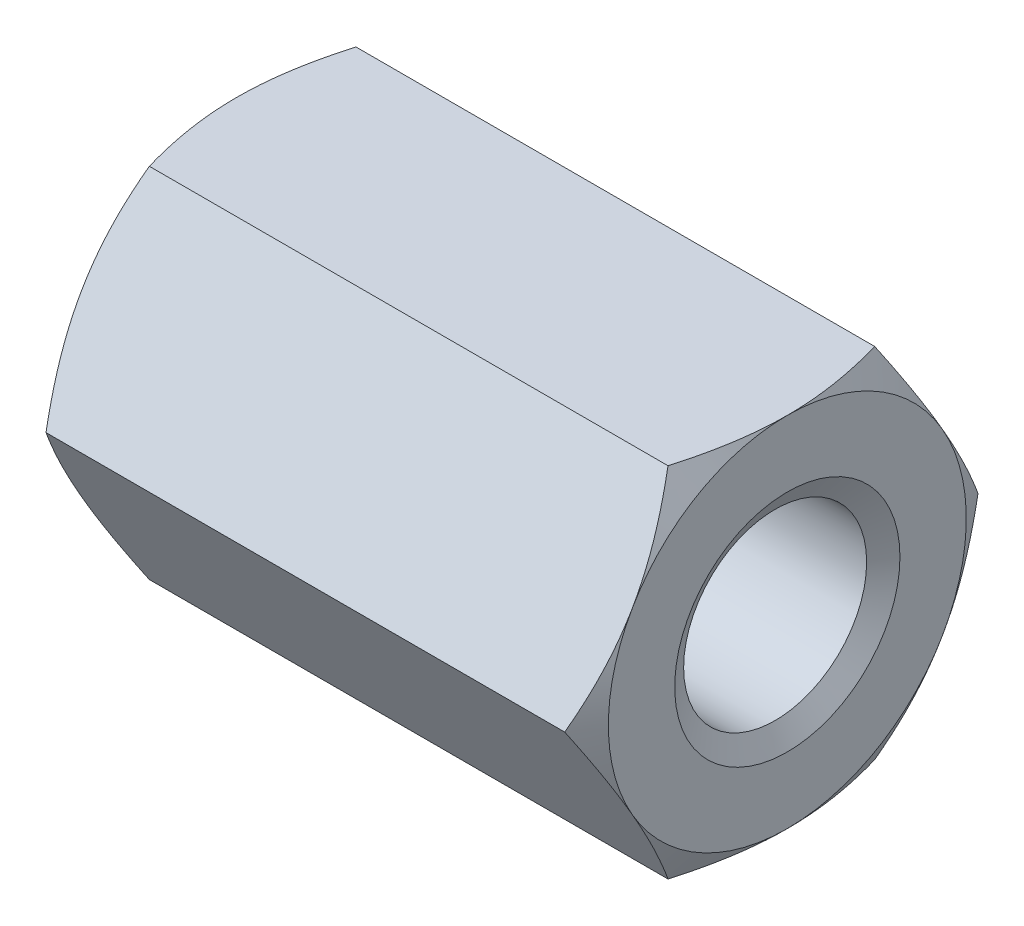
ISO-10303-21;
HEADER;
FILE_DESCRIPTION(('STEP AP214'),'2;1');
FILE_NAME('part.step','',(''),(''),'','','');
FILE_SCHEMA(('AUTOMOTIVE_DESIGN { 1 0 10303 214 1 1 1 1 }'));
ENDSEC;
DATA;
#1=APPLICATION_CONTEXT('core data for automotive mechanical design processes');
#2=APPLICATION_PROTOCOL_DEFINITION('international standard','automotive_design',2000,#1);
#3=PRODUCT_CONTEXT('',#1,'mechanical');
#4=PRODUCT('Part','Part','',(#3));
#5=PRODUCT_RELATED_PRODUCT_CATEGORY('part','',(#4));
#6=PRODUCT_DEFINITION_FORMATION('','',#4);
#7=PRODUCT_DEFINITION_CONTEXT('part definition',#1,'design');
#8=PRODUCT_DEFINITION('design','',#6,#7);
#9=PRODUCT_DEFINITION_SHAPE('','',#8);
#10=(LENGTH_UNIT() NAMED_UNIT(*) SI_UNIT(.MILLI.,.METRE.));
#11=(NAMED_UNIT(*) PLANE_ANGLE_UNIT() SI_UNIT($,.RADIAN.));
#12=(NAMED_UNIT(*) SI_UNIT($,.STERADIAN.) SOLID_ANGLE_UNIT());
#13=UNCERTAINTY_MEASURE_WITH_UNIT(LENGTH_MEASURE(1.E-05),#10,'distance_accuracy_value','');
#14=(GEOMETRIC_REPRESENTATION_CONTEXT(3) GLOBAL_UNCERTAINTY_ASSIGNED_CONTEXT((#13)) GLOBAL_UNIT_ASSIGNED_CONTEXT((#10,
#11,#12)) REPRESENTATION_CONTEXT('',''));
#15=CARTESIAN_POINT('',(0.,0.,0.));
#16=DIRECTION('',(0.,0.,1.));
#17=DIRECTION('',(1.,0.,0.));
#18=AXIS2_PLACEMENT_3D('',#15,#16,#17);
#19=CARTESIAN_POINT('',(0.,-6.5,3.75277674973257));
#20=DIRECTION('',(0.,-0.5,0.866025403784439));
#21=DIRECTION('',(-1.,0.,0.));
#22=AXIS2_PLACEMENT_3D('',#19,#20,#21);
#23=PLANE('',#22);
#24=CARTESIAN_POINT('',(0.,-3.25,5.62916512459885));
#25=CARTESIAN_POINT('',(0.,-4.75833024919772,4.75833024919771));
#26=CARTESIAN_POINT('',(0.580556583600765,-6.5,3.75277674973257));
#27=(BOUNDED_CURVE() B_SPLINE_CURVE(2,(#24,#25,#26),.UNSPECIFIED.,.F.,
.F.) B_SPLINE_CURVE_WITH_KNOTS((3,3),(0.380711317203908,0.761422634407816),
.UNSPECIFIED.) CURVE() GEOMETRIC_REPRESENTATION_ITEM() RATIONAL_B_SPLINE_CURVE((1.,
1.03795484930205,1.)) REPRESENTATION_ITEM(''));
#28=CARTESIAN_POINT('',(0.,-3.25,5.62916512459885));
#29=VERTEX_POINT('',#28);
#30=CARTESIAN_POINT('',(0.580556583600765,-6.5,3.75277674973257));
#31=VERTEX_POINT('',#30);
#32=EDGE_CURVE('E157',#29,#31,#27,.T.);
#33=ORIENTED_EDGE('',*,*,#32,.T.);
#34=DIRECTION('',(1.,0.,0.));
#35=VECTOR('',#34,1.);
#36=CARTESIAN_POINT('',(0.,-6.5,3.75277674973257));
#37=LINE('',#36,#35);
#38=CARTESIAN_POINT('',(19.4194434163992,-6.5,3.75277674973257));
#39=VERTEX_POINT('',#38);
#40=EDGE_CURVE('E11',#31,#39,#37,.T.);
#41=ORIENTED_EDGE('',*,*,#40,.T.);
#42=CARTESIAN_POINT('',(19.4194434163992,-6.5,3.75277674973256));
#43=CARTESIAN_POINT('',(20.,-4.75833024919772,4.75833024919769));
#44=CARTESIAN_POINT('',(20.,-3.25,5.62916512459885));
#45=(BOUNDED_CURVE() B_SPLINE_CURVE(2,(#42,#43,#44),.UNSPECIFIED.,.F.,
.F.) B_SPLINE_CURVE_WITH_KNOTS((3,3),(0.,0.380711317203909),
.UNSPECIFIED.) CURVE() GEOMETRIC_REPRESENTATION_ITEM() RATIONAL_B_SPLINE_CURVE((1.,
1.03795484930203,1.)) REPRESENTATION_ITEM(''));
#46=CARTESIAN_POINT('',(20.,-3.25,5.62916512459885));
#47=VERTEX_POINT('',#46);
#48=EDGE_CURVE('E154',#39,#47,#45,.T.);
#49=ORIENTED_EDGE('',*,*,#48,.T.);
#50=CARTESIAN_POINT('',(20.,-3.25,5.62916512459885));
#51=CARTESIAN_POINT('',(20.,-1.74166975080229,6.5));
#52=CARTESIAN_POINT('',(19.4194434163992,0.,7.50555349946514));
#53=(BOUNDED_CURVE() B_SPLINE_CURVE(2,(#50,#51,#52),.UNSPECIFIED.,.F.,
.F.) B_SPLINE_CURVE_WITH_KNOTS((3,3),(0.380711317203909,0.761422634407818),
.UNSPECIFIED.) CURVE() GEOMETRIC_REPRESENTATION_ITEM() RATIONAL_B_SPLINE_CURVE((1.,
1.03795484930204,1.)) REPRESENTATION_ITEM(''));
#54=CARTESIAN_POINT('',(19.4194434163992,0.,7.50555349946513));
#55=VERTEX_POINT('',#54);
#56=EDGE_CURVE('E179',#47,#55,#53,.T.);
#57=ORIENTED_EDGE('',*,*,#56,.T.);
#58=DIRECTION('',(1.,0.,0.));
#59=VECTOR('',#58,1.);
#60=CARTESIAN_POINT('',(0.,0.,7.50555349946513));
#61=LINE('',#60,#59);
#62=CARTESIAN_POINT('',(0.580556583600765,0.,7.50555349946513));
#63=VERTEX_POINT('',#62);
#64=EDGE_CURVE('E327',#63,#55,#61,.T.);
#65=ORIENTED_EDGE('',*,*,#64,.F.);
#66=CARTESIAN_POINT('',(0.580556583600765,0.,7.50555349946513));
#67=CARTESIAN_POINT('',(0.,-1.74166975080229,6.50000000000001));
#68=CARTESIAN_POINT('',(0.,-3.25,5.62916512459885));
#69=(BOUNDED_CURVE() B_SPLINE_CURVE(2,(#66,#67,#68),.UNSPECIFIED.,.F.,
.F.) B_SPLINE_CURVE_WITH_KNOTS((3,3),(0.,0.380711317203908),
.UNSPECIFIED.) CURVE() GEOMETRIC_REPRESENTATION_ITEM() RATIONAL_B_SPLINE_CURVE((1.,
1.03795484930205,1.)) REPRESENTATION_ITEM(''));
#70=EDGE_CURVE('E208',#63,#29,#69,.T.);
#71=ORIENTED_EDGE('',*,*,#70,.T.);
#72=EDGE_LOOP('',(#33,#41,#49,#57,#65,#71));
#73=FACE_BOUND('',#72,.T.);
#74=ADVANCED_FACE('F16',(#73),#23,.T.);
#75=CARTESIAN_POINT('',(0.,-6.5,-3.75277674973257));
#76=DIRECTION('',(0.,-1.,0.));
#77=DIRECTION('',(0.,0.,-1.));
#78=AXIS2_PLACEMENT_3D('',#75,#76,#77);
#79=PLANE('',#78);
#80=CARTESIAN_POINT('',(0.,-6.5,0.));
#81=CARTESIAN_POINT('',(0.,-6.5,-1.7416697508023));
#82=CARTESIAN_POINT('',(0.580556583600766,-6.5,-3.75277674973257));
#83=(BOUNDED_CURVE() B_SPLINE_CURVE(2,(#80,#81,#82),.UNSPECIFIED.,.F.,
.F.) B_SPLINE_CURVE_WITH_KNOTS((3,3),(0.380711317203908,0.761422634407816),
.UNSPECIFIED.) CURVE() GEOMETRIC_REPRESENTATION_ITEM() RATIONAL_B_SPLINE_CURVE((1.,
1.03795484930204,1.)) REPRESENTATION_ITEM(''));
#84=CARTESIAN_POINT('',(0.,-6.5,0.));
#85=VERTEX_POINT('',#84);
#86=CARTESIAN_POINT('',(0.580556583600765,-6.5,-3.75277674973257));
#87=VERTEX_POINT('',#86);
#88=EDGE_CURVE('E357',#85,#87,#83,.T.);
#89=ORIENTED_EDGE('',*,*,#88,.T.);
#90=DIRECTION('',(1.,0.,0.));
#91=VECTOR('',#90,1.);
#92=CARTESIAN_POINT('',(0.,-6.5,-3.75277674973257));
#93=LINE('',#92,#91);
#94=CARTESIAN_POINT('',(19.4194434163992,-6.5,-3.75277674973257));
#95=VERTEX_POINT('',#94);
#96=EDGE_CURVE('E27',#87,#95,#93,.T.);
#97=ORIENTED_EDGE('',*,*,#96,.T.);
#98=CARTESIAN_POINT('',(19.4194434163992,-6.5,-3.75277674973256));
#99=CARTESIAN_POINT('',(20.,-6.5,-1.74166975080229));
#100=CARTESIAN_POINT('',(20.,-6.5,0.));
#101=(BOUNDED_CURVE() B_SPLINE_CURVE(2,(#98,#99,#100),.UNSPECIFIED.,.F.,
.F.) B_SPLINE_CURVE_WITH_KNOTS((3,3),(0.,0.380711317203908),
.UNSPECIFIED.) CURVE() GEOMETRIC_REPRESENTATION_ITEM() RATIONAL_B_SPLINE_CURVE((1.,
1.03795484930204,1.)) REPRESENTATION_ITEM(''));
#102=CARTESIAN_POINT('',(20.,-6.5,0.));
#103=VERTEX_POINT('',#102);
#104=EDGE_CURVE('E177',#95,#103,#101,.T.);
#105=ORIENTED_EDGE('',*,*,#104,.T.);
#106=CARTESIAN_POINT('',(20.,-6.5,0.));
#107=CARTESIAN_POINT('',(20.,-6.5,1.74166975080229));
#108=CARTESIAN_POINT('',(19.4194434163992,-6.5,3.75277674973256));
#109=(BOUNDED_CURVE() B_SPLINE_CURVE(2,(#106,#107,#108),.UNSPECIFIED.,.F.,
.F.) B_SPLINE_CURVE_WITH_KNOTS((3,3),(0.380711317203908,0.761422634407815),
.UNSPECIFIED.) CURVE() GEOMETRIC_REPRESENTATION_ITEM() RATIONAL_B_SPLINE_CURVE((1.,
1.03795484930204,1.)) REPRESENTATION_ITEM(''));
#110=EDGE_CURVE('E166',#103,#39,#109,.T.);
#111=ORIENTED_EDGE('',*,*,#110,.T.);
#112=ORIENTED_EDGE('',*,*,#40,.F.);
#113=CARTESIAN_POINT('',(0.580556583600766,-6.5,3.75277674973257));
#114=CARTESIAN_POINT('',(0.,-6.5,1.7416697508023));
#115=CARTESIAN_POINT('',(0.,-6.5,0.));
#116=(BOUNDED_CURVE() B_SPLINE_CURVE(2,(#113,#114,#115),.UNSPECIFIED.,.F.,
.F.) B_SPLINE_CURVE_WITH_KNOTS((3,3),(0.,0.380711317203908),
.UNSPECIFIED.) CURVE() GEOMETRIC_REPRESENTATION_ITEM() RATIONAL_B_SPLINE_CURVE((1.,
1.03795484930204,1.)) REPRESENTATION_ITEM(''));
#117=EDGE_CURVE('E199',#31,#85,#116,.T.);
#118=ORIENTED_EDGE('',*,*,#117,.T.);
#119=EDGE_LOOP('',(#89,#97,#105,#111,#112,#118));
#120=FACE_BOUND('',#119,.T.);
#121=ADVANCED_FACE('F175',(#120),#79,.T.);
#122=CARTESIAN_POINT('',(0.,0.,-7.50555349946513));
#123=DIRECTION('',(0.,-0.5,-0.866025403784439));
#124=DIRECTION('',(0.,-0.866025403784439,0.5));
#125=AXIS2_PLACEMENT_3D('',#122,#123,#124);
#126=PLANE('',#125);
#127=CARTESIAN_POINT('',(0.,-3.25,-5.62916512459885));
#128=CARTESIAN_POINT('',(0.,-1.74166975080229,-6.50000000000001));
#129=CARTESIAN_POINT('',(0.580556583600766,0.,-7.50555349946514));
#130=(BOUNDED_CURVE() B_SPLINE_CURVE(2,(#127,#128,#129),.UNSPECIFIED.,.F.,
.F.) B_SPLINE_CURVE_WITH_KNOTS((3,3),(0.380711317203908,0.761422634407816),
.UNSPECIFIED.) CURVE() GEOMETRIC_REPRESENTATION_ITEM() RATIONAL_B_SPLINE_CURVE((1.,
1.03795484930205,1.)) REPRESENTATION_ITEM(''));
#131=CARTESIAN_POINT('',(0.,-3.25,-5.62916512459885));
#132=VERTEX_POINT('',#131);
#133=CARTESIAN_POINT('',(0.580556583600765,0.,-7.50555349946513));
#134=VERTEX_POINT('',#133);
#135=EDGE_CURVE('E263',#132,#134,#130,.T.);
#136=ORIENTED_EDGE('',*,*,#135,.T.);
#137=DIRECTION('',(1.,0.,0.));
#138=VECTOR('',#137,1.);
#139=CARTESIAN_POINT('',(0.,0.,-7.50555349946513));
#140=LINE('',#139,#138);
#141=CARTESIAN_POINT('',(19.4194434163992,0.,-7.50555349946513));
#142=VERTEX_POINT('',#141);
#143=EDGE_CURVE('E40',#134,#142,#140,.T.);
#144=ORIENTED_EDGE('',*,*,#143,.T.);
#145=CARTESIAN_POINT('',(19.4194434163992,0.,-7.50555349946513));
#146=CARTESIAN_POINT('',(20.,-1.7416697508023,-6.50000000000001));
#147=CARTESIAN_POINT('',(20.,-3.25,-5.62916512459885));
#148=(BOUNDED_CURVE() B_SPLINE_CURVE(2,(#145,#146,#147),.UNSPECIFIED.,.F.,
.F.) B_SPLINE_CURVE_WITH_KNOTS((3,3),(0.,0.380711317203907),
.UNSPECIFIED.) CURVE() GEOMETRIC_REPRESENTATION_ITEM() RATIONAL_B_SPLINE_CURVE((1.,
1.03795484930205,1.)) REPRESENTATION_ITEM(''));
#149=CARTESIAN_POINT('',(20.,-3.25,-5.62916512459885));
#150=VERTEX_POINT('',#149);
#151=EDGE_CURVE('E324',#142,#150,#148,.T.);
#152=ORIENTED_EDGE('',*,*,#151,.T.);
#153=CARTESIAN_POINT('',(20.,-3.25,-5.62916512459885));
#154=CARTESIAN_POINT('',(20.,-4.7583302491977,-4.7583302491977));
#155=CARTESIAN_POINT('',(19.4194434163992,-6.5,-3.75277674973257));
#156=(BOUNDED_CURVE() B_SPLINE_CURVE(2,(#153,#154,#155),.UNSPECIFIED.,.F.,
.F.) B_SPLINE_CURVE_WITH_KNOTS((3,3),(0.380711317203907,0.761422634407814),
.UNSPECIFIED.) CURVE() GEOMETRIC_REPRESENTATION_ITEM() RATIONAL_B_SPLINE_CURVE((1.,
1.03795484930206,1.)) REPRESENTATION_ITEM(''));
#157=EDGE_CURVE('E222',#150,#95,#156,.T.);
#158=ORIENTED_EDGE('',*,*,#157,.T.);
#159=ORIENTED_EDGE('',*,*,#96,.F.);
#160=CARTESIAN_POINT('',(0.580556583600766,-6.5,-3.75277674973257));
#161=CARTESIAN_POINT('',(0.,-4.75833024919771,-4.7583302491977));
#162=CARTESIAN_POINT('',(0.,-3.25,-5.62916512459885));
#163=(BOUNDED_CURVE() B_SPLINE_CURVE(2,(#160,#161,#162),.UNSPECIFIED.,.F.,
.F.) B_SPLINE_CURVE_WITH_KNOTS((3,3),(0.,0.380711317203908),
.UNSPECIFIED.) CURVE() GEOMETRIC_REPRESENTATION_ITEM() RATIONAL_B_SPLINE_CURVE((1.,
1.03795484930204,1.)) REPRESENTATION_ITEM(''));
#164=EDGE_CURVE('E294',#87,#132,#163,.T.);
#165=ORIENTED_EDGE('',*,*,#164,.T.);
#166=EDGE_LOOP('',(#136,#144,#152,#158,#159,#165));
#167=FACE_BOUND('',#166,.T.);
#168=ADVANCED_FACE('F363',(#167),#126,.T.);
#169=CARTESIAN_POINT('',(0.,0.,7.50555349946513));
#170=DIRECTION('',(0.,0.5,0.866025403784439));
#171=DIRECTION('',(1.,0.,0.));
#172=AXIS2_PLACEMENT_3D('',#169,#170,#171);
#173=PLANE('',#172);
#174=CARTESIAN_POINT('',(0.580556583600766,6.5,3.75277674973256));
#175=CARTESIAN_POINT('',(0.,4.75833024919772,4.75833024919771));
#176=CARTESIAN_POINT('',(0.,3.25,5.62916512459885));
#177=(BOUNDED_CURVE() B_SPLINE_CURVE(2,(#174,#175,#176),.UNSPECIFIED.,.F.,
.F.) B_SPLINE_CURVE_WITH_KNOTS((3,3),(0.,0.380711317203908),
.UNSPECIFIED.) CURVE() GEOMETRIC_REPRESENTATION_ITEM() RATIONAL_B_SPLINE_CURVE((1.,
1.03795484930205,1.)) REPRESENTATION_ITEM(''));
#178=CARTESIAN_POINT('',(0.580556583600765,6.5,3.75277674973256));
#179=VERTEX_POINT('',#178);
#180=CARTESIAN_POINT('',(0.,3.25,5.62916512459885));
#181=VERTEX_POINT('',#180);
#182=EDGE_CURVE('E206',#179,#181,#177,.T.);
#183=ORIENTED_EDGE('',*,*,#182,.T.);
#184=CARTESIAN_POINT('',(0.,3.25,5.62916512459885));
#185=CARTESIAN_POINT('',(0.,1.7416697508023,6.5));
#186=CARTESIAN_POINT('',(0.580556583600766,0.,7.50555349946514));
#187=(BOUNDED_CURVE() B_SPLINE_CURVE(2,(#184,#185,#186),.UNSPECIFIED.,.F.,
.F.) B_SPLINE_CURVE_WITH_KNOTS((3,3),(0.380711317203908,0.761422634407816),
.UNSPECIFIED.) CURVE() GEOMETRIC_REPRESENTATION_ITEM() RATIONAL_B_SPLINE_CURVE((1.,
1.03795484930204,1.)) REPRESENTATION_ITEM(''));
#188=EDGE_CURVE('E214',#181,#63,#187,.T.);
#189=ORIENTED_EDGE('',*,*,#188,.T.);
#190=ORIENTED_EDGE('',*,*,#64,.T.);
#191=CARTESIAN_POINT('',(19.4194434163992,0.,7.50555349946513));
#192=CARTESIAN_POINT('',(20.,1.7416697508023,6.50000000000001));
#193=CARTESIAN_POINT('',(20.,3.25,5.62916512459885));
#194=(BOUNDED_CURVE() B_SPLINE_CURVE(2,(#191,#192,#193),.UNSPECIFIED.,.F.,
.F.) B_SPLINE_CURVE_WITH_KNOTS((3,3),(0.,0.380711317203907),
.UNSPECIFIED.) CURVE() GEOMETRIC_REPRESENTATION_ITEM() RATIONAL_B_SPLINE_CURVE((1.,
1.03795484930205,1.)) REPRESENTATION_ITEM(''));
#195=CARTESIAN_POINT('',(20.,3.25,5.62916512459885));
#196=VERTEX_POINT('',#195);
#197=EDGE_CURVE('E185',#55,#196,#194,.T.);
#198=ORIENTED_EDGE('',*,*,#197,.T.);
#199=CARTESIAN_POINT('',(20.,3.25,5.62916512459885));
#200=CARTESIAN_POINT('',(20.,4.75833024919771,4.7583302491977));
#201=CARTESIAN_POINT('',(19.4194434163992,6.5,3.75277674973257));
#202=(BOUNDED_CURVE() B_SPLINE_CURVE(2,(#199,#200,#201),.UNSPECIFIED.,.F.,
.F.) B_SPLINE_CURVE_WITH_KNOTS((3,3),(0.380711317203907,0.761422634407815),
.UNSPECIFIED.) CURVE() GEOMETRIC_REPRESENTATION_ITEM() RATIONAL_B_SPLINE_CURVE((1.,
1.03795484930206,1.)) REPRESENTATION_ITEM(''));
#203=CARTESIAN_POINT('',(19.4194434163992,6.5,3.75277674973256));
#204=VERTEX_POINT('',#203);
#205=EDGE_CURVE('E68',#196,#204,#202,.T.);
#206=ORIENTED_EDGE('',*,*,#205,.T.);
#207=DIRECTION('',(1.,0.,0.));
#208=VECTOR('',#207,1.);
#209=CARTESIAN_POINT('',(0.,6.5,3.75277674973256));
#210=LINE('',#209,#208);
#211=EDGE_CURVE('E261',#179,#204,#210,.T.);
#212=ORIENTED_EDGE('',*,*,#211,.F.);
#213=EDGE_LOOP('',(#183,#189,#190,#198,#206,#212));
#214=FACE_BOUND('',#213,.T.);
#215=ADVANCED_FACE('F525',(#214),#173,.T.);
#216=CARTESIAN_POINT('',(0.,6.5,3.75277674973256));
#217=DIRECTION('',(0.,1.,0.));
#218=DIRECTION('',(0.,0.,-1.));
#219=AXIS2_PLACEMENT_3D('',#216,#217,#218);
#220=PLANE('',#219);
#221=CARTESIAN_POINT('',(0.580556583600766,6.5,-3.75277674973257));
#222=CARTESIAN_POINT('',(0.,6.5,-1.7416697508023));
#223=CARTESIAN_POINT('',(0.,6.5,0.));
#224=(BOUNDED_CURVE() B_SPLINE_CURVE(2,(#221,#222,#223),.UNSPECIFIED.,.F.,
.F.) B_SPLINE_CURVE_WITH_KNOTS((3,3),(0.,0.380711317203908),
.UNSPECIFIED.) CURVE() GEOMETRIC_REPRESENTATION_ITEM() RATIONAL_B_SPLINE_CURVE((1.,
1.03795484930204,1.)) REPRESENTATION_ITEM(''));
#225=CARTESIAN_POINT('',(0.580556583600765,6.5,-3.75277674973257));
#226=VERTEX_POINT('',#225);
#227=CARTESIAN_POINT('',(0.,6.5,0.));
#228=VERTEX_POINT('',#227);
#229=EDGE_CURVE('E281',#226,#228,#224,.T.);
#230=ORIENTED_EDGE('',*,*,#229,.T.);
#231=CARTESIAN_POINT('',(0.,6.5,0.));
#232=CARTESIAN_POINT('',(0.,6.5,1.7416697508023));
#233=CARTESIAN_POINT('',(0.580556583600766,6.5,3.75277674973257));
#234=(BOUNDED_CURVE() B_SPLINE_CURVE(2,(#231,#232,#233),.UNSPECIFIED.,.F.,
.F.) B_SPLINE_CURVE_WITH_KNOTS((3,3),(0.380711317203908,0.761422634407816),
.UNSPECIFIED.) CURVE() GEOMETRIC_REPRESENTATION_ITEM() RATIONAL_B_SPLINE_CURVE((1.,
1.03795484930204,1.)) REPRESENTATION_ITEM(''));
#235=EDGE_CURVE('E190',#228,#179,#234,.T.);
#236=ORIENTED_EDGE('',*,*,#235,.T.);
#237=ORIENTED_EDGE('',*,*,#211,.T.);
#238=CARTESIAN_POINT('',(19.4194434163992,6.5,3.75277674973256));
#239=CARTESIAN_POINT('',(20.,6.5,1.74166975080229));
#240=CARTESIAN_POINT('',(20.,6.5,0.));
#241=(BOUNDED_CURVE() B_SPLINE_CURVE(2,(#238,#239,#240),.UNSPECIFIED.,.F.,
.F.) B_SPLINE_CURVE_WITH_KNOTS((3,3),(0.,0.380711317203908),
.UNSPECIFIED.) CURVE() GEOMETRIC_REPRESENTATION_ITEM() RATIONAL_B_SPLINE_CURVE((1.,
1.03795484930204,1.)) REPRESENTATION_ITEM(''));
#242=CARTESIAN_POINT('',(20.,6.5,0.));
#243=VERTEX_POINT('',#242);
#244=EDGE_CURVE('E171',#204,#243,#241,.T.);
#245=ORIENTED_EDGE('',*,*,#244,.T.);
#246=CARTESIAN_POINT('',(20.,6.5,0.));
#247=CARTESIAN_POINT('',(20.,6.50000000000001,-1.7416697508023));
#248=CARTESIAN_POINT('',(19.4194434163992,6.5,-3.75277674973257));
#249=(BOUNDED_CURVE() B_SPLINE_CURVE(2,(#246,#247,#248),.UNSPECIFIED.,.F.,
.F.) B_SPLINE_CURVE_WITH_KNOTS((3,3),(0.380711317203908,0.761422634407816),
.UNSPECIFIED.) CURVE() GEOMETRIC_REPRESENTATION_ITEM() RATIONAL_B_SPLINE_CURVE((1.,
1.03795484930205,1.)) REPRESENTATION_ITEM(''));
#250=CARTESIAN_POINT('',(19.4194434163992,6.5,-3.75277674973257));
#251=VERTEX_POINT('',#250);
#252=EDGE_CURVE('E83',#243,#251,#249,.T.);
#253=ORIENTED_EDGE('',*,*,#252,.T.);
#254=DIRECTION('',(1.,0.,0.));
#255=VECTOR('',#254,1.);
#256=CARTESIAN_POINT('',(0.,6.5,-3.75277674973257));
#257=LINE('',#256,#255);
#258=EDGE_CURVE('E262',#226,#251,#257,.T.);
#259=ORIENTED_EDGE('',*,*,#258,.F.);
#260=EDGE_LOOP('',(#230,#236,#237,#245,#253,#259));
#261=FACE_BOUND('',#260,.T.);
#262=ADVANCED_FACE('F534',(#261),#220,.T.);
#263=CARTESIAN_POINT('',(0.,6.5,-3.75277674973257));
#264=DIRECTION('',(0.,0.5,-0.866025403784439));
#265=DIRECTION('',(-1.,0.,0.));
#266=AXIS2_PLACEMENT_3D('',#263,#264,#265);
#267=PLANE('',#266);
#268=CARTESIAN_POINT('',(0.580556583600766,0.,-7.50555349946513));
#269=CARTESIAN_POINT('',(0.,1.7416697508023,-6.50000000000001));
#270=CARTESIAN_POINT('',(0.,3.25,-5.62916512459885));
#271=(BOUNDED_CURVE() B_SPLINE_CURVE(2,(#268,#269,#270),.UNSPECIFIED.,.F.,
.F.) B_SPLINE_CURVE_WITH_KNOTS((3,3),(0.,0.380711317203908),
.UNSPECIFIED.) CURVE() GEOMETRIC_REPRESENTATION_ITEM() RATIONAL_B_SPLINE_CURVE((1.,
1.03795484930205,1.)) REPRESENTATION_ITEM(''));
#272=CARTESIAN_POINT('',(0.,3.25,-5.62916512459885));
#273=VERTEX_POINT('',#272);
#274=EDGE_CURVE('E267',#134,#273,#271,.T.);
#275=ORIENTED_EDGE('',*,*,#274,.T.);
#276=CARTESIAN_POINT('',(0.,3.25,-5.62916512459885));
#277=CARTESIAN_POINT('',(0.,4.75833024919771,-4.75833024919772));
#278=CARTESIAN_POINT('',(0.580556583600765,6.5,-3.75277674973257));
#279=(BOUNDED_CURVE() B_SPLINE_CURVE(2,(#276,#277,#278),.UNSPECIFIED.,.F.,
.F.) B_SPLINE_CURVE_WITH_KNOTS((3,3),(0.380711317203908,0.761422634407815),
.UNSPECIFIED.) CURVE() GEOMETRIC_REPRESENTATION_ITEM() RATIONAL_B_SPLINE_CURVE((1.,
1.03795484930205,1.)) REPRESENTATION_ITEM(''));
#280=EDGE_CURVE('E354',#273,#226,#279,.T.);
#281=ORIENTED_EDGE('',*,*,#280,.T.);
#282=ORIENTED_EDGE('',*,*,#258,.T.);
#283=CARTESIAN_POINT('',(19.4194434163992,6.5,-3.75277674973257));
#284=CARTESIAN_POINT('',(20.,4.75833024919771,-4.7583302491977));
#285=CARTESIAN_POINT('',(20.,3.25,-5.62916512459885));
#286=(BOUNDED_CURVE() B_SPLINE_CURVE(2,(#283,#284,#285),.UNSPECIFIED.,.F.,
.F.) B_SPLINE_CURVE_WITH_KNOTS((3,3),(0.,0.380711317203908),
.UNSPECIFIED.) CURVE() GEOMETRIC_REPRESENTATION_ITEM() RATIONAL_B_SPLINE_CURVE((1.,
1.03795484930201,1.)) REPRESENTATION_ITEM(''));
#287=CARTESIAN_POINT('',(20.,3.25,-5.62916512459885));
#288=VERTEX_POINT('',#287);
#289=EDGE_CURVE('E302',#251,#288,#286,.T.);
#290=ORIENTED_EDGE('',*,*,#289,.T.);
#291=CARTESIAN_POINT('',(20.,3.25,-5.62916512459885));
#292=CARTESIAN_POINT('',(20.,1.74166975080229,-6.50000000000002));
#293=CARTESIAN_POINT('',(19.4194434163992,0.,-7.50555349946513));
#294=(BOUNDED_CURVE() B_SPLINE_CURVE(2,(#291,#292,#293),.UNSPECIFIED.,.F.,
.F.) B_SPLINE_CURVE_WITH_KNOTS((3,3),(0.380711317203908,0.761422634407815),
.UNSPECIFIED.) CURVE() GEOMETRIC_REPRESENTATION_ITEM() RATIONAL_B_SPLINE_CURVE((1.,
1.03795484930201,1.)) REPRESENTATION_ITEM(''));
#295=EDGE_CURVE('E383',#288,#142,#294,.T.);
#296=ORIENTED_EDGE('',*,*,#295,.T.);
#297=ORIENTED_EDGE('',*,*,#143,.F.);
#298=EDGE_LOOP('',(#275,#281,#282,#290,#296,#297));
#299=FACE_BOUND('',#298,.T.);
#300=ADVANCED_FACE('F531',(#299),#267,.T.);
#301=CARTESIAN_POINT('',(19.7097217081996,0.,0.));
#302=DIRECTION('',(-1.,0.,0.));
#303=DIRECTION('',(0.,1.,0.));
#304=AXIS2_PLACEMENT_3D('',#301,#302,#303);
#305=CONICAL_SURFACE('',#304,7.00277674973257,1.0471975511966);
#306=ORIENTED_EDGE('',*,*,#295,.F.);
#307=CARTESIAN_POINT('',(20.,0.,0.));
#308=DIRECTION('',(1.,0.,0.));
#309=DIRECTION('',(0.,1.,0.));
#310=AXIS2_PLACEMENT_3D('',#307,#308,#309);
#311=CIRCLE('',#310,6.5);
#312=EDGE_CURVE('E416',#150,#288,#311,.T.);
#313=ORIENTED_EDGE('',*,*,#312,.F.);
#314=ORIENTED_EDGE('',*,*,#151,.F.);
#315=EDGE_LOOP('',(#306,#313,#314));
#316=FACE_BOUND('',#315,.T.);
#317=ADVANCED_FACE('F528',(#316),#305,.T.);
#318=CARTESIAN_POINT('',(19.7097217081996,0.,0.));
#319=DIRECTION('',(-1.,0.,0.));
#320=DIRECTION('',(0.,1.,0.));
#321=AXIS2_PLACEMENT_3D('',#318,#319,#320);
#322=CONICAL_SURFACE('',#321,7.00277674973257,1.0471975511966);
#323=ORIENTED_EDGE('',*,*,#157,.F.);
#324=CARTESIAN_POINT('',(20.,0.,0.));
#325=DIRECTION('',(1.,0.,0.));
#326=DIRECTION('',(0.,1.,0.));
#327=AXIS2_PLACEMENT_3D('',#324,#325,#326);
#328=CIRCLE('',#327,6.5);
#329=EDGE_CURVE('E409',#103,#150,#328,.T.);
#330=ORIENTED_EDGE('',*,*,#329,.F.);
#331=ORIENTED_EDGE('',*,*,#104,.F.);
#332=EDGE_LOOP('',(#323,#330,#331));
#333=FACE_BOUND('',#332,.T.);
#334=ADVANCED_FACE('F530',(#333),#322,.T.);
#335=CARTESIAN_POINT('',(19.7097217081996,0.,0.));
#336=DIRECTION('',(-1.,0.,0.));
#337=DIRECTION('',(0.,1.,0.));
#338=AXIS2_PLACEMENT_3D('',#335,#336,#337);
#339=CONICAL_SURFACE('',#338,7.00277674973257,1.0471975511966);
#340=ORIENTED_EDGE('',*,*,#289,.F.);
#341=ORIENTED_EDGE('',*,*,#252,.F.);
#342=CARTESIAN_POINT('',(20.,0.,0.));
#343=DIRECTION('',(1.,0.,0.));
#344=DIRECTION('',(0.,1.,0.));
#345=AXIS2_PLACEMENT_3D('',#342,#343,#344);
#346=CIRCLE('',#345,6.5);
#347=EDGE_CURVE('E457',#288,#243,#346,.T.);
#348=ORIENTED_EDGE('',*,*,#347,.F.);
#349=EDGE_LOOP('',(#340,#341,#348));
#350=FACE_BOUND('',#349,.T.);
#351=ADVANCED_FACE('F539',(#350),#339,.T.);
#352=CARTESIAN_POINT('',(19.7097217081996,0.,0.));
#353=DIRECTION('',(-1.,0.,0.));
#354=DIRECTION('',(0.,1.,0.));
#355=AXIS2_PLACEMENT_3D('',#352,#353,#354);
#356=CONICAL_SURFACE('',#355,7.00277674973257,1.0471975511966);
#357=ORIENTED_EDGE('',*,*,#244,.F.);
#358=ORIENTED_EDGE('',*,*,#205,.F.);
#359=CARTESIAN_POINT('',(20.,0.,0.));
#360=DIRECTION('',(1.,0.,0.));
#361=DIRECTION('',(0.,1.,0.));
#362=AXIS2_PLACEMENT_3D('',#359,#360,#361);
#363=CIRCLE('',#362,6.5);
#364=EDGE_CURVE('E460',#243,#196,#363,.T.);
#365=ORIENTED_EDGE('',*,*,#364,.F.);
#366=EDGE_LOOP('',(#357,#358,#365));
#367=FACE_BOUND('',#366,.T.);
#368=ADVANCED_FACE('F541',(#367),#356,.T.);
#369=CARTESIAN_POINT('',(19.7097217081996,0.,0.));
#370=DIRECTION('',(-1.,0.,0.));
#371=DIRECTION('',(0.,1.,0.));
#372=AXIS2_PLACEMENT_3D('',#369,#370,#371);
#373=CONICAL_SURFACE('',#372,7.00277674973257,1.0471975511966);
#374=ORIENTED_EDGE('',*,*,#110,.F.);
#375=CARTESIAN_POINT('',(20.,0.,0.));
#376=DIRECTION('',(1.,0.,0.));
#377=DIRECTION('',(0.,1.,0.));
#378=AXIS2_PLACEMENT_3D('',#375,#376,#377);
#379=CIRCLE('',#378,6.5);
#380=EDGE_CURVE('E169',#47,#103,#379,.T.);
#381=ORIENTED_EDGE('',*,*,#380,.F.);
#382=ORIENTED_EDGE('',*,*,#48,.F.);
#383=EDGE_LOOP('',(#374,#381,#382));
#384=FACE_BOUND('',#383,.T.);
#385=ADVANCED_FACE('F165',(#384),#373,.T.);
#386=CARTESIAN_POINT('',(19.7097217081996,0.,0.));
#387=DIRECTION('',(-1.,0.,0.));
#388=DIRECTION('',(0.,1.,0.));
#389=AXIS2_PLACEMENT_3D('',#386,#387,#388);
#390=CONICAL_SURFACE('',#389,7.00277674973257,1.0471975511966);
#391=ORIENTED_EDGE('',*,*,#197,.F.);
#392=ORIENTED_EDGE('',*,*,#56,.F.);
#393=CARTESIAN_POINT('',(20.,0.,0.));
#394=DIRECTION('',(1.,0.,0.));
#395=DIRECTION('',(0.,1.,0.));
#396=AXIS2_PLACEMENT_3D('',#393,#394,#395);
#397=CIRCLE('',#396,6.5);
#398=EDGE_CURVE('E20',#196,#47,#397,.T.);
#399=ORIENTED_EDGE('',*,*,#398,.F.);
#400=EDGE_LOOP('',(#391,#392,#399));
#401=FACE_BOUND('',#400,.T.);
#402=ADVANCED_FACE('F543',(#401),#390,.T.);
#403=CARTESIAN_POINT('',(0.290278291800383,0.,0.));
#404=DIRECTION('',(1.,0.,0.));
#405=DIRECTION('',(0.,1.,0.));
#406=AXIS2_PLACEMENT_3D('',#403,#404,#405);
#407=CONICAL_SURFACE('',#406,7.00277674973257,1.0471975511966);
#408=ORIENTED_EDGE('',*,*,#274,.F.);
#409=ORIENTED_EDGE('',*,*,#135,.F.);
#410=CARTESIAN_POINT('',(0.,0.,0.));
#411=DIRECTION('',(-1.,0.,0.));
#412=DIRECTION('',(0.,1.,0.));
#413=AXIS2_PLACEMENT_3D('',#410,#411,#412);
#414=CIRCLE('',#413,6.5);
#415=EDGE_CURVE('E229',#273,#132,#414,.T.);
#416=ORIENTED_EDGE('',*,*,#415,.F.);
#417=EDGE_LOOP('',(#408,#409,#416));
#418=FACE_BOUND('',#417,.T.);
#419=ADVANCED_FACE('F18',(#418),#407,.T.);
#420=CARTESIAN_POINT('',(0.290278291800383,0.,0.));
#421=DIRECTION('',(1.,0.,0.));
#422=DIRECTION('',(0.,1.,0.));
#423=AXIS2_PLACEMENT_3D('',#420,#421,#422);
#424=CONICAL_SURFACE('',#423,7.00277674973257,1.0471975511966);
#425=ORIENTED_EDGE('',*,*,#280,.F.);
#426=CARTESIAN_POINT('',(0.,0.,0.));
#427=DIRECTION('',(-1.,0.,0.));
#428=DIRECTION('',(0.,1.,0.));
#429=AXIS2_PLACEMENT_3D('',#426,#427,#428);
#430=CIRCLE('',#429,6.5);
#431=EDGE_CURVE('E236',#228,#273,#430,.T.);
#432=ORIENTED_EDGE('',*,*,#431,.F.);
#433=ORIENTED_EDGE('',*,*,#229,.F.);
#434=EDGE_LOOP('',(#425,#432,#433));
#435=FACE_BOUND('',#434,.T.);
#436=ADVANCED_FACE('F352',(#435),#424,.T.);
#437=CARTESIAN_POINT('',(0.290278291800383,0.,0.));
#438=DIRECTION('',(1.,0.,0.));
#439=DIRECTION('',(0.,1.,0.));
#440=AXIS2_PLACEMENT_3D('',#437,#438,#439);
#441=CONICAL_SURFACE('',#440,7.00277674973257,1.0471975511966);
#442=ORIENTED_EDGE('',*,*,#164,.F.);
#443=ORIENTED_EDGE('',*,*,#88,.F.);
#444=CARTESIAN_POINT('',(0.,0.,0.));
#445=DIRECTION('',(-1.,0.,0.));
#446=DIRECTION('',(0.,1.,0.));
#447=AXIS2_PLACEMENT_3D('',#444,#445,#446);
#448=CIRCLE('',#447,6.5);
#449=EDGE_CURVE('E235',#132,#85,#448,.T.);
#450=ORIENTED_EDGE('',*,*,#449,.F.);
#451=EDGE_LOOP('',(#442,#443,#450));
#452=FACE_BOUND('',#451,.T.);
#453=ADVANCED_FACE('F367',(#452),#441,.T.);
#454=CARTESIAN_POINT('',(0.290278291800383,0.,0.));
#455=DIRECTION('',(1.,0.,0.));
#456=DIRECTION('',(0.,1.,0.));
#457=AXIS2_PLACEMENT_3D('',#454,#455,#456);
#458=CONICAL_SURFACE('',#457,7.00277674973257,1.0471975511966);
#459=ORIENTED_EDGE('',*,*,#235,.F.);
#460=CARTESIAN_POINT('',(0.,0.,0.));
#461=DIRECTION('',(-1.,0.,0.));
#462=DIRECTION('',(0.,1.,0.));
#463=AXIS2_PLACEMENT_3D('',#460,#461,#462);
#464=CIRCLE('',#463,6.5);
#465=EDGE_CURVE('E246',#181,#228,#464,.T.);
#466=ORIENTED_EDGE('',*,*,#465,.F.);
#467=ORIENTED_EDGE('',*,*,#182,.F.);
#468=EDGE_LOOP('',(#459,#466,#467));
#469=FACE_BOUND('',#468,.T.);
#470=ADVANCED_FACE('F347',(#469),#458,.T.);
#471=CARTESIAN_POINT('',(0.290278291800383,0.,0.));
#472=DIRECTION('',(1.,0.,0.));
#473=DIRECTION('',(0.,1.,0.));
#474=AXIS2_PLACEMENT_3D('',#471,#472,#473);
#475=CONICAL_SURFACE('',#474,7.00277674973257,1.0471975511966);
#476=ORIENTED_EDGE('',*,*,#117,.F.);
#477=ORIENTED_EDGE('',*,*,#32,.F.);
#478=CARTESIAN_POINT('',(0.,0.,0.));
#479=DIRECTION('',(-1.,0.,0.));
#480=DIRECTION('',(0.,1.,0.));
#481=AXIS2_PLACEMENT_3D('',#478,#479,#480);
#482=CIRCLE('',#481,6.5);
#483=EDGE_CURVE('E243',#85,#29,#482,.T.);
#484=ORIENTED_EDGE('',*,*,#483,.F.);
#485=EDGE_LOOP('',(#476,#477,#484));
#486=FACE_BOUND('',#485,.T.);
#487=ADVANCED_FACE('F511',(#486),#475,.T.);
#488=CARTESIAN_POINT('',(0.290278291800383,0.,0.));
#489=DIRECTION('',(1.,0.,0.));
#490=DIRECTION('',(0.,1.,0.));
#491=AXIS2_PLACEMENT_3D('',#488,#489,#490);
#492=CONICAL_SURFACE('',#491,7.00277674973257,1.0471975511966);
#493=ORIENTED_EDGE('',*,*,#188,.F.);
#494=CARTESIAN_POINT('',(0.,0.,0.));
#495=DIRECTION('',(-1.,0.,0.));
#496=DIRECTION('',(0.,1.,0.));
#497=AXIS2_PLACEMENT_3D('',#494,#495,#496);
#498=CIRCLE('',#497,6.5);
#499=EDGE_CURVE('E253',#29,#181,#498,.T.);
#500=ORIENTED_EDGE('',*,*,#499,.F.);
#501=ORIENTED_EDGE('',*,*,#70,.F.);
#502=EDGE_LOOP('',(#493,#500,#501));
#503=FACE_BOUND('',#502,.T.);
#504=ADVANCED_FACE('F341',(#503),#492,.T.);
#505=CARTESIAN_POINT('',(0.,0.,0.));
#506=DIRECTION('',(1.,0.,0.));
#507=DIRECTION('',(0.,1.,0.));
#508=AXIS2_PLACEMENT_3D('',#505,#506,#507);
#509=PLANE('',#508);
#510=CARTESIAN_POINT('',(0.,0.,0.));
#511=DIRECTION('',(-1.,0.,0.));
#512=DIRECTION('',(0.,0.,-1.));
#513=AXIS2_PLACEMENT_3D('',#510,#511,#512);
#514=CIRCLE('',#513,4.0903125);
#515=CARTESIAN_POINT('',(0.,0.,4.0903125));
#516=VERTEX_POINT('',#515);
#517=EDGE_CURVE('E417',#516,#516,#514,.T.);
#518=ORIENTED_EDGE('',*,*,#517,.F.);
#519=EDGE_LOOP('',(#518));
#520=FACE_BOUND('',#519,.T.);
#521=ORIENTED_EDGE('',*,*,#499,.T.);
#522=ORIENTED_EDGE('',*,*,#465,.T.);
#523=ORIENTED_EDGE('',*,*,#431,.T.);
#524=ORIENTED_EDGE('',*,*,#415,.T.);
#525=ORIENTED_EDGE('',*,*,#449,.T.);
#526=ORIENTED_EDGE('',*,*,#483,.T.);
#527=EDGE_LOOP('',(#521,#522,#523,#524,#525,#526));
#528=FACE_BOUND('',#527,.T.);
#529=ADVANCED_FACE('F335',(#520,#528),#509,.F.);
#530=CARTESIAN_POINT('',(0.221359701646484,0.,0.));
#531=DIRECTION('',(-1.,0.,0.));
#532=DIRECTION('',(0.,0.,-1.));
#533=AXIS2_PLACEMENT_3D('',#530,#531,#532);
#534=CONICAL_SURFACE('',#533,3.70690625,1.0471975511966);
#535=ORIENTED_EDGE('',*,*,#517,.T.);
#536=DIRECTION('',(0.5,0.,-0.86602540378444));
#537=VECTOR('',#536,1.);
#538=CARTESIAN_POINT('',(0.221359701646484,0.,3.70690625));
#539=LINE('',#538,#537);
#540=CARTESIAN_POINT('',(0.442719403292968,0.,3.3235));
#541=VERTEX_POINT('',#540);
#542=EDGE_CURVE('E330',#516,#541,#539,.T.);
#543=ORIENTED_EDGE('',*,*,#542,.T.);
#544=CARTESIAN_POINT('',(0.442719403292968,0.,0.));
#545=DIRECTION('',(1.,0.,0.));
#546=DIRECTION('',(0.,0.,-1.));
#547=AXIS2_PLACEMENT_3D('',#544,#545,#546);
#548=CIRCLE('',#547,3.3235);
#549=CARTESIAN_POINT('',(0.442719403292968,0.,-3.3235));
#550=VERTEX_POINT('',#549);
#551=EDGE_CURVE('E289',#541,#550,#548,.T.);
#552=ORIENTED_EDGE('',*,*,#551,.T.);
#553=CARTESIAN_POINT('',(0.442719403292968,0.,0.));
#554=DIRECTION('',(1.,0.,0.));
#555=DIRECTION('',(0.,0.,-1.));
#556=AXIS2_PLACEMENT_3D('',#553,#554,#555);
#557=CIRCLE('',#556,3.3235);
#558=EDGE_CURVE('E282',#550,#541,#557,.T.);
#559=ORIENTED_EDGE('',*,*,#558,.T.);
#560=ORIENTED_EDGE('',*,*,#542,.F.);
#561=EDGE_LOOP('',(#535,#543,#552,#559,#560));
#562=FACE_BOUND('',#561,.T.);
#563=ADVANCED_FACE('F498',(#562),#534,.F.);
#564=CARTESIAN_POINT('',(20.,0.,0.));
#565=DIRECTION('',(1.,0.,0.));
#566=DIRECTION('',(0.,1.,0.));
#567=AXIS2_PLACEMENT_3D('',#564,#565,#566);
#568=PLANE('',#567);
#569=CARTESIAN_POINT('',(20.,0.,0.));
#570=DIRECTION('',(1.,0.,0.));
#571=DIRECTION('',(0.,0.,1.));
#572=AXIS2_PLACEMENT_3D('',#569,#570,#571);
#573=CIRCLE('',#572,4.0903125);
#574=CARTESIAN_POINT('',(20.,0.,-4.0903125));
#575=VERTEX_POINT('',#574);
#576=EDGE_CURVE('E452',#575,#575,#573,.T.);
#577=ORIENTED_EDGE('',*,*,#576,.F.);
#578=EDGE_LOOP('',(#577));
#579=FACE_BOUND('',#578,.T.);
#580=ORIENTED_EDGE('',*,*,#380,.T.);
#581=ORIENTED_EDGE('',*,*,#329,.T.);
#582=ORIENTED_EDGE('',*,*,#312,.T.);
#583=ORIENTED_EDGE('',*,*,#347,.T.);
#584=ORIENTED_EDGE('',*,*,#364,.T.);
#585=ORIENTED_EDGE('',*,*,#398,.T.);
#586=EDGE_LOOP('',(#580,#581,#582,#583,#584,#585));
#587=FACE_BOUND('',#586,.T.);
#588=ADVANCED_FACE('F509',(#579,#587),#568,.T.);
#589=CARTESIAN_POINT('',(28.1839197652373,0.,0.));
#590=DIRECTION('',(-1.,0.,0.));
#591=DIRECTION('',(0.,0.,1.));
#592=AXIS2_PLACEMENT_3D('',#589,#590,#591);
#593=CYLINDRICAL_SURFACE('',#592,3.3235);
#594=ORIENTED_EDGE('',*,*,#551,.F.);
#595=ORIENTED_EDGE('',*,*,#558,.F.);
#596=DIRECTION('',(1.,0.,0.));
#597=VECTOR('',#596,1.);
#598=CARTESIAN_POINT('',(28.1839197652373,0.,-3.3235));
#599=LINE('',#598,#597);
#600=CARTESIAN_POINT('',(19.557280596707,0.,-3.3235));
#601=VERTEX_POINT('',#600);
#602=EDGE_CURVE('E256',#550,#601,#599,.T.);
#603=ORIENTED_EDGE('',*,*,#602,.T.);
#604=CARTESIAN_POINT('',(19.557280596707,0.,0.));
#605=DIRECTION('',(-1.,0.,0.));
#606=DIRECTION('',(0.,0.,1.));
#607=AXIS2_PLACEMENT_3D('',#604,#605,#606);
#608=CIRCLE('',#607,3.3235);
#609=EDGE_CURVE('E438',#601,#601,#608,.T.);
#610=ORIENTED_EDGE('',*,*,#609,.F.);
#611=ORIENTED_EDGE('',*,*,#602,.F.);
#612=EDGE_LOOP('',(#594,#595,#603,#610,#611));
#613=FACE_BOUND('',#612,.T.);
#614=ADVANCED_FACE('F494',(#613),#593,.F.);
#615=CARTESIAN_POINT('',(19.7786402983535,0.,0.));
#616=DIRECTION('',(1.,0.,0.));
#617=DIRECTION('',(0.,0.,1.));
#618=AXIS2_PLACEMENT_3D('',#615,#616,#617);
#619=CONICAL_SURFACE('',#618,3.70690625,1.0471975511966);
#620=ORIENTED_EDGE('',*,*,#576,.T.);
#621=DIRECTION('',(-0.5,0.,0.866025403784438));
#622=VECTOR('',#621,1.);
#623=CARTESIAN_POINT('',(19.7786402983535,0.,-3.70690625));
#624=LINE('',#623,#622);
#625=EDGE_CURVE('E444',#575,#601,#624,.T.);
#626=ORIENTED_EDGE('',*,*,#625,.T.);
#627=ORIENTED_EDGE('',*,*,#609,.T.);
#628=ORIENTED_EDGE('',*,*,#625,.F.);
#629=EDGE_LOOP('',(#620,#626,#627,#628));
#630=FACE_BOUND('',#629,.T.);
#631=ADVANCED_FACE('F551',(#630),#619,.F.);
#632=CLOSED_SHELL('',(#74,#121,#168,#215,#262,#300,#317,#334,#351,#368,#385,#402,#419,#436,#453,
#470,#487,#504,#529,#563,#588,#614,#631));
#633=MANIFOLD_SOLID_BREP('B1',#632);
#634=ADVANCED_BREP_SHAPE_REPRESENTATION('',(#18,#633),#14);
#635=SHAPE_DEFINITION_REPRESENTATION(#9,#634);
ENDSEC;
END-ISO-10303-21;
